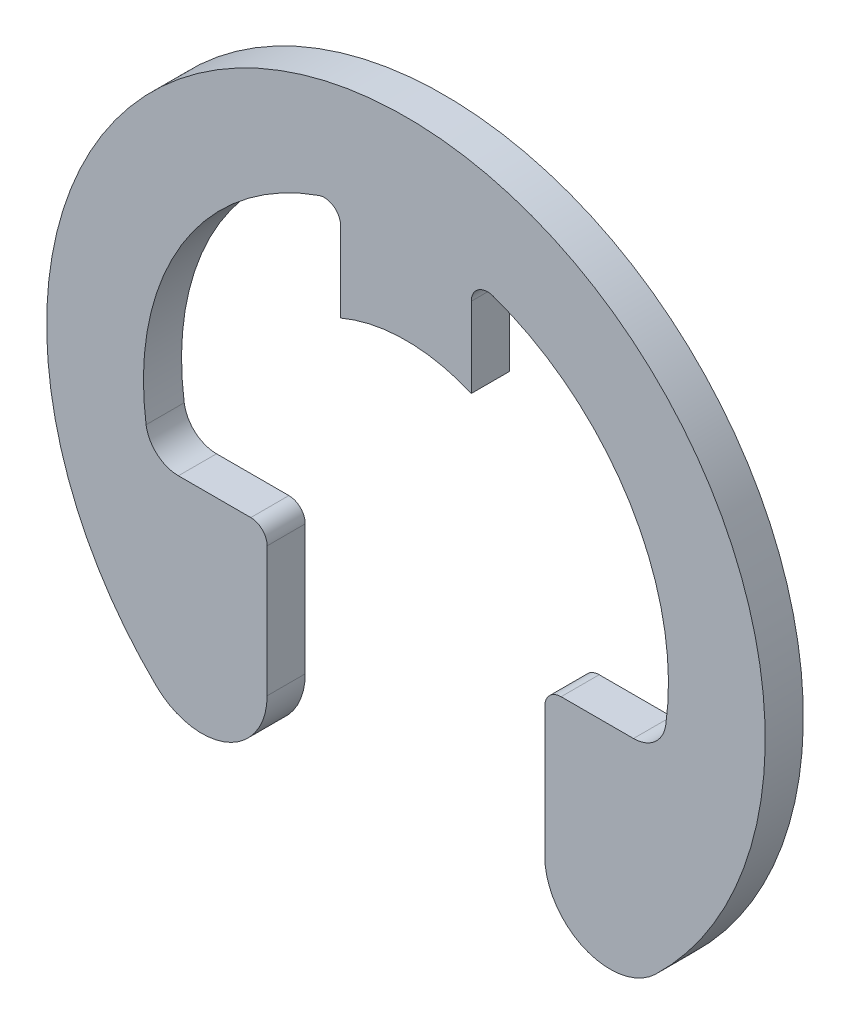
ISO-10303-21;
HEADER;
FILE_DESCRIPTION(('STEP AP214'),'2;1');
FILE_NAME('part.step','',(''),(''),'','','');
FILE_SCHEMA(('AUTOMOTIVE_DESIGN { 1 0 10303 214 1 1 1 1 }'));
ENDSEC;
DATA;
#1=APPLICATION_CONTEXT('core data for automotive mechanical design processes');
#2=APPLICATION_PROTOCOL_DEFINITION('international standard','automotive_design',2000,#1);
#3=PRODUCT_CONTEXT('',#1,'mechanical');
#4=PRODUCT('Part','Part','',(#3));
#5=PRODUCT_RELATED_PRODUCT_CATEGORY('part','',(#4));
#6=PRODUCT_DEFINITION_FORMATION('','',#4);
#7=PRODUCT_DEFINITION_CONTEXT('part definition',#1,'design');
#8=PRODUCT_DEFINITION('design','',#6,#7);
#9=PRODUCT_DEFINITION_SHAPE('','',#8);
#10=(LENGTH_UNIT() NAMED_UNIT(*) SI_UNIT(.MILLI.,.METRE.));
#11=(NAMED_UNIT(*) PLANE_ANGLE_UNIT() SI_UNIT($,.RADIAN.));
#12=(NAMED_UNIT(*) SI_UNIT($,.STERADIAN.) SOLID_ANGLE_UNIT());
#13=UNCERTAINTY_MEASURE_WITH_UNIT(LENGTH_MEASURE(1.E-05),#10,'distance_accuracy_value','');
#14=(GEOMETRIC_REPRESENTATION_CONTEXT(3) GLOBAL_UNCERTAINTY_ASSIGNED_CONTEXT((#13)) GLOBAL_UNIT_ASSIGNED_CONTEXT((#10,
#11,#12)) REPRESENTATION_CONTEXT('',''));
#15=CARTESIAN_POINT('',(0.,0.,0.));
#16=DIRECTION('',(0.,0.,1.));
#17=DIRECTION('',(1.,0.,0.));
#18=AXIS2_PLACEMENT_3D('',#15,#16,#17);
#19=CARTESIAN_POINT('',(4.7625,-5.89632434785133,0.444500000000002));
#20=DIRECTION('',(0.,0.,1.));
#21=DIRECTION('',(1.,0.,0.));
#22=AXIS2_PLACEMENT_3D('',#19,#20,#21);
#23=PLANE('',#22);
#24=CARTESIAN_POINT('',(3.61949999999996,-2.86667565214866,0.444500000000002));
#25=DIRECTION('',(0.,0.,1.));
#26=DIRECTION('',(1.,0.,0.));
#27=AXIS2_PLACEMENT_3D('',#24,#25,#26);
#28=CIRCLE('',#27,0.380999999999999);
#29=CARTESIAN_POINT('',(3.23849999999994,-2.86667565214866,0.444500000000002));
#30=VERTEX_POINT('',#29);
#31=CARTESIAN_POINT('',(3.61949999999996,-2.48567565214866,0.444500000000002));
#32=VERTEX_POINT('',#31);
#33=EDGE_CURVE('E169',#30,#32,#28,.F.);
#34=ORIENTED_EDGE('',*,*,#33,.F.);
#35=DIRECTION('',(0.,1.,0.));
#36=VECTOR('',#35,1.);
#37=CARTESIAN_POINT('',(3.23849999999994,-2.86667565214866,0.444500000000002));
#38=LINE('',#37,#36);
#39=CARTESIAN_POINT('',(3.23849999999997,-5.89632434785133,0.444500000000002));
#40=VERTEX_POINT('',#39);
#41=EDGE_CURVE('E162',#30,#40,#38,.F.);
#42=ORIENTED_EDGE('',*,*,#41,.T.);
#43=CARTESIAN_POINT('',(4.7625,-5.89632434785133,0.444500000000002));
#44=DIRECTION('',(0.,0.,1.));
#45=DIRECTION('',(1.,0.,0.));
#46=AXIS2_PLACEMENT_3D('',#43,#44,#45);
#47=CIRCLE('',#46,1.524);
#48=CARTESIAN_POINT('',(5.82083330642028,-6.99291297287054,0.444500000000002));
#49=VERTEX_POINT('',#48);
#50=EDGE_CURVE('E150',#49,#40,#47,.F.);
#51=ORIENTED_EDGE('',*,*,#50,.F.);
#52=CARTESIAN_POINT('',(0.,-0.961675652148666,0.444500000000002));
#53=DIRECTION('',(0.,0.,1.));
#54=DIRECTION('',(1.,0.,0.));
#55=AXIS2_PLACEMENT_3D('',#52,#53,#54);
#56=CIRCLE('',#55,8.382);
#57=CARTESIAN_POINT('',(-5.82083333333337,-6.99291294689634,0.444500000000002));
#58=VERTEX_POINT('',#57);
#59=EDGE_CURVE('E19',#58,#49,#56,.F.);
#60=ORIENTED_EDGE('',*,*,#59,.F.);
#61=CARTESIAN_POINT('',(-4.7625,-5.89632434785133,0.444500000000002));
#62=DIRECTION('',(0.,0.,1.));
#63=DIRECTION('',(1.,0.,0.));
#64=AXIS2_PLACEMENT_3D('',#61,#62,#63);
#65=CIRCLE('',#64,1.524);
#66=CARTESIAN_POINT('',(-3.23850000000012,-5.89632434785133,0.444500000000002));
#67=VERTEX_POINT('',#66);
#68=EDGE_CURVE('E136',#67,#58,#65,.F.);
#69=ORIENTED_EDGE('',*,*,#68,.F.);
#70=DIRECTION('',(0.,1.,0.));
#71=VECTOR('',#70,1.);
#72=CARTESIAN_POINT('',(-3.23850000000012,-5.89632434785133,0.444500000000002));
#73=LINE('',#72,#71);
#74=CARTESIAN_POINT('',(-3.23850000000013,-2.86667565214866,0.444500000000002));
#75=VERTEX_POINT('',#74);
#76=EDGE_CURVE('E158',#67,#75,#73,.T.);
#77=ORIENTED_EDGE('',*,*,#76,.T.);
#78=CARTESIAN_POINT('',(-3.61950000000014,-2.86667565214866,0.444500000000002));
#79=DIRECTION('',(0.,0.,1.));
#80=DIRECTION('',(1.,0.,0.));
#81=AXIS2_PLACEMENT_3D('',#78,#79,#80);
#82=CIRCLE('',#81,0.380999999999999);
#83=CARTESIAN_POINT('',(-3.61950000000014,-2.48567565214866,0.444500000000002));
#84=VERTEX_POINT('',#83);
#85=EDGE_CURVE('E183',#84,#75,#82,.F.);
#86=ORIENTED_EDGE('',*,*,#85,.F.);
#87=DIRECTION('',(1.,0.,0.));
#88=VECTOR('',#87,1.);
#89=CARTESIAN_POINT('',(-3.61950000000014,-2.48567565214866,0.444500000000002));
#90=LINE('',#89,#88);
#91=CARTESIAN_POINT('',(-5.30816038101955,-2.48567565214866,0.444500000000002));
#92=VERTEX_POINT('',#91);
#93=EDGE_CURVE('E179',#84,#92,#90,.F.);
#94=ORIENTED_EDGE('',*,*,#93,.T.);
#95=CARTESIAN_POINT('',(-5.30816038101955,-1.72367565214867,0.444500000000002));
#96=DIRECTION('',(0.,0.,1.));
#97=DIRECTION('',(1.,0.,0.));
#98=AXIS2_PLACEMENT_3D('',#95,#96,#97);
#99=CIRCLE('',#98,0.761999999999999);
#100=CARTESIAN_POINT('',(-6.06242828947552,-1.83195271469384,0.444500000000002));
#101=VERTEX_POINT('',#100);
#102=EDGE_CURVE('E239',#92,#101,#99,.F.);
#103=ORIENTED_EDGE('',*,*,#102,.T.);
#104=CARTESIAN_POINT('',(0.,-0.961675652148661,0.444500000000002));
#105=DIRECTION('',(0.,0.,1.));
#106=DIRECTION('',(1.,0.,0.));
#107=AXIS2_PLACEMENT_3D('',#104,#105,#106);
#108=CIRCLE('',#107,6.12457499999999);
#109=CARTESIAN_POINT('',(-2.03136811457101,4.81620999172915,0.444500000000002));
#110=VERTEX_POINT('',#109);
#111=EDGE_CURVE('E236',#101,#110,#108,.F.);
#112=ORIENTED_EDGE('',*,*,#111,.T.);
#113=CARTESIAN_POINT('',(-1.90500000000007,4.4567769665078,0.444500000000002));
#114=DIRECTION('',(0.,0.,1.));
#115=DIRECTION('',(1.,0.,0.));
#116=AXIS2_PLACEMENT_3D('',#113,#114,#115);
#117=CIRCLE('',#116,0.381000000000001);
#118=CARTESIAN_POINT('',(-1.52400000000006,4.4567769665078,0.444500000000002));
#119=VERTEX_POINT('',#118);
#120=EDGE_CURVE('E233',#110,#119,#117,.F.);
#121=ORIENTED_EDGE('',*,*,#120,.T.);
#122=DIRECTION('',(0.,1.,0.));
#123=VECTOR('',#122,1.);
#124=CARTESIAN_POINT('',(-1.52400000000006,4.45677696650779,0.444500000000002));
#125=LINE('',#124,#123);
#126=CARTESIAN_POINT('',(-1.52400000000005,2.59251527160597,0.444500000000002));
#127=VERTEX_POINT('',#126);
#128=EDGE_CURVE('E175',#119,#127,#125,.F.);
#129=ORIENTED_EDGE('',*,*,#128,.T.);
#130=CARTESIAN_POINT('',(0.,-0.961675652148671,0.444500000000002));
#131=DIRECTION('',(0.,0.,1.));
#132=DIRECTION('',(1.,0.,0.));
#133=AXIS2_PLACEMENT_3D('',#130,#131,#132);
#134=CIRCLE('',#133,3.86715);
#135=CARTESIAN_POINT('',(1.52399999999988,2.59251527160602,0.444500000000002));
#136=VERTEX_POINT('',#135);
#137=EDGE_CURVE('E231',#127,#136,#134,.F.);
#138=ORIENTED_EDGE('',*,*,#137,.T.);
#139=DIRECTION('',(0.,1.,0.));
#140=VECTOR('',#139,1.);
#141=CARTESIAN_POINT('',(1.52399999999988,2.59251527160599,0.444500000000002));
#142=LINE('',#141,#140);
#143=CARTESIAN_POINT('',(1.52399999999997,4.45677696650779,0.444500000000002));
#144=VERTEX_POINT('',#143);
#145=EDGE_CURVE('E171',#136,#144,#142,.T.);
#146=ORIENTED_EDGE('',*,*,#145,.T.);
#147=CARTESIAN_POINT('',(1.90500000000007,4.45677696650779,0.444500000000002));
#148=DIRECTION('',(0.,0.,1.));
#149=DIRECTION('',(1.,0.,0.));
#150=AXIS2_PLACEMENT_3D('',#147,#148,#149);
#151=CIRCLE('',#150,0.381000000000001);
#152=CARTESIAN_POINT('',(2.03136814974417,4.8162099793631,0.444500000000002));
#153=VERTEX_POINT('',#152);
#154=EDGE_CURVE('E229',#144,#153,#151,.F.);
#155=ORIENTED_EDGE('',*,*,#154,.T.);
#156=CARTESIAN_POINT('',(0.,-0.961675652148662,0.444500000000002));
#157=DIRECTION('',(0.,0.,1.));
#158=DIRECTION('',(1.,0.,0.));
#159=AXIS2_PLACEMENT_3D('',#156,#157,#158);
#160=CIRCLE('',#159,6.124575);
#161=CARTESIAN_POINT('',(6.06242829268276,-1.83195269235131,0.444500000000002));
#162=VERTEX_POINT('',#161);
#163=EDGE_CURVE('E226',#153,#162,#160,.F.);
#164=ORIENTED_EDGE('',*,*,#163,.T.);
#165=CARTESIAN_POINT('',(5.30816038101937,-1.72367565214867,0.444500000000002));
#166=DIRECTION('',(0.,0.,1.));
#167=DIRECTION('',(1.,0.,0.));
#168=AXIS2_PLACEMENT_3D('',#165,#166,#167);
#169=CIRCLE('',#168,0.761999999999999);
#170=CARTESIAN_POINT('',(5.30816038101937,-2.48567565214866,0.444500000000002));
#171=VERTEX_POINT('',#170);
#172=EDGE_CURVE('E223',#162,#171,#169,.F.);
#173=ORIENTED_EDGE('',*,*,#172,.T.);
#174=DIRECTION('',(1.,0.,0.));
#175=VECTOR('',#174,1.);
#176=CARTESIAN_POINT('',(5.30816038101937,-2.48567565214866,0.444500000000002));
#177=LINE('',#176,#175);
#178=EDGE_CURVE('E166',#171,#32,#177,.F.);
#179=ORIENTED_EDGE('',*,*,#178,.T.);
#180=EDGE_LOOP('',(#34,#42,#51,#60,#69,#77,#86,#94,#103,#112,#121,#129,#138,#146,#155,#164,#173,#179));
#181=FACE_BOUND('',#180,.T.);
#182=ADVANCED_FACE('F16',(#181),#23,.T.);
#183=CARTESIAN_POINT('',(0.,-0.961675652148666,0.444500000000002));
#184=DIRECTION('',(0.,0.,1.));
#185=DIRECTION('',(1.,0.,0.));
#186=AXIS2_PLACEMENT_3D('',#183,#184,#185);
#187=CYLINDRICAL_SURFACE('',#186,8.382);
#188=ORIENTED_EDGE('',*,*,#59,.T.);
#189=DIRECTION('',(0.,0.,1.));
#190=VECTOR('',#189,1.);
#191=CARTESIAN_POINT('',(5.82083327950723,-6.99291299884471,0.444500000000002));
#192=LINE('',#191,#190);
#193=CARTESIAN_POINT('',(5.82083330642028,-6.99291297287054,-0.444499999999999));
#194=VERTEX_POINT('',#193);
#195=EDGE_CURVE('E164',#194,#49,#192,.T.);
#196=ORIENTED_EDGE('',*,*,#195,.F.);
#197=CARTESIAN_POINT('',(0.,-0.961675652148666,-0.444499999999999));
#198=DIRECTION('',(0.,0.,1.));
#199=DIRECTION('',(1.,0.,0.));
#200=AXIS2_PLACEMENT_3D('',#197,#198,#199);
#201=CIRCLE('',#200,8.382);
#202=CARTESIAN_POINT('',(-5.82083333333337,-6.99291294689634,-0.444499999999999));
#203=VERTEX_POINT('',#202);
#204=EDGE_CURVE('E156',#194,#203,#201,.T.);
#205=ORIENTED_EDGE('',*,*,#204,.T.);
#206=DIRECTION('',(0.,0.,1.));
#207=VECTOR('',#206,1.);
#208=CARTESIAN_POINT('',(-5.8208333333334,-6.9929129468963,0.444500000000002));
#209=LINE('',#208,#207);
#210=EDGE_CURVE('E141',#58,#203,#209,.F.);
#211=ORIENTED_EDGE('',*,*,#210,.F.);
#212=EDGE_LOOP('',(#188,#196,#205,#211));
#213=FACE_BOUND('',#212,.T.);
#214=ADVANCED_FACE('F155',(#213),#187,.T.);
#215=CARTESIAN_POINT('',(-4.7625,-5.89632434785133,0.444500000000002));
#216=DIRECTION('',(0.,0.,1.));
#217=DIRECTION('',(1.,0.,0.));
#218=AXIS2_PLACEMENT_3D('',#215,#216,#217);
#219=CYLINDRICAL_SURFACE('',#218,1.524);
#220=ORIENTED_EDGE('',*,*,#68,.T.);
#221=ORIENTED_EDGE('',*,*,#210,.T.);
#222=CARTESIAN_POINT('',(-4.7625,-5.89632434785133,-0.444499999999999));
#223=DIRECTION('',(0.,0.,1.));
#224=DIRECTION('',(1.,0.,0.));
#225=AXIS2_PLACEMENT_3D('',#222,#223,#224);
#226=CIRCLE('',#225,1.524);
#227=CARTESIAN_POINT('',(-3.23850000000012,-5.89632434785133,-0.444499999999999));
#228=VERTEX_POINT('',#227);
#229=EDGE_CURVE('E217',#203,#228,#226,.T.);
#230=ORIENTED_EDGE('',*,*,#229,.T.);
#231=DIRECTION('',(0.,0.,1.));
#232=VECTOR('',#231,1.);
#233=CARTESIAN_POINT('',(-3.23850000000012,-5.89632434785133,0.444500000000002));
#234=LINE('',#233,#232);
#235=EDGE_CURVE('E143',#228,#67,#234,.T.);
#236=ORIENTED_EDGE('',*,*,#235,.T.);
#237=EDGE_LOOP('',(#220,#221,#230,#236));
#238=FACE_BOUND('',#237,.T.);
#239=ADVANCED_FACE('F138',(#238),#219,.T.);
#240=CARTESIAN_POINT('',(-3.23850000000012,-5.89632434785133,0.444500000000002));
#241=DIRECTION('',(-1.,0.,0.));
#242=DIRECTION('',(0.,0.,1.));
#243=AXIS2_PLACEMENT_3D('',#240,#241,#242);
#244=PLANE('',#243);
#245=DIRECTION('',(0.,0.,1.));
#246=VECTOR('',#245,1.);
#247=CARTESIAN_POINT('',(-3.23850000000014,-2.86667565214866,0.444500000000002));
#248=LINE('',#247,#246);
#249=CARTESIAN_POINT('',(-3.23850000000013,-2.86667565214866,-0.444499999999999));
#250=VERTEX_POINT('',#249);
#251=EDGE_CURVE('E241',#75,#250,#248,.F.);
#252=ORIENTED_EDGE('',*,*,#251,.F.);
#253=ORIENTED_EDGE('',*,*,#76,.F.);
#254=ORIENTED_EDGE('',*,*,#235,.F.);
#255=DIRECTION('',(0.,1.,0.));
#256=VECTOR('',#255,1.);
#257=CARTESIAN_POINT('',(-3.23850000000012,-5.89632434785133,-0.444499999999999));
#258=LINE('',#257,#256);
#259=EDGE_CURVE('E216',#228,#250,#258,.T.);
#260=ORIENTED_EDGE('',*,*,#259,.T.);
#261=EDGE_LOOP('',(#252,#253,#254,#260));
#262=FACE_BOUND('',#261,.T.);
#263=ADVANCED_FACE('F341',(#262),#244,.F.);
#264=CARTESIAN_POINT('',(-3.61950000000014,-2.86667565214866,0.444500000000002));
#265=DIRECTION('',(0.,0.,1.));
#266=DIRECTION('',(1.,0.,0.));
#267=AXIS2_PLACEMENT_3D('',#264,#265,#266);
#268=CYLINDRICAL_SURFACE('',#267,0.380999999999999);
#269=ORIENTED_EDGE('',*,*,#85,.T.);
#270=ORIENTED_EDGE('',*,*,#251,.T.);
#271=CARTESIAN_POINT('',(-3.61950000000014,-2.86667565214866,-0.444499999999999));
#272=DIRECTION('',(0.,0.,1.));
#273=DIRECTION('',(1.,0.,0.));
#274=AXIS2_PLACEMENT_3D('',#271,#272,#273);
#275=CIRCLE('',#274,0.380999999999999);
#276=CARTESIAN_POINT('',(-3.61950000000014,-2.48567565214866,-0.444499999999999));
#277=VERTEX_POINT('',#276);
#278=EDGE_CURVE('E213',#250,#277,#275,.T.);
#279=ORIENTED_EDGE('',*,*,#278,.T.);
#280=DIRECTION('',(0.,0.,1.));
#281=VECTOR('',#280,1.);
#282=CARTESIAN_POINT('',(-3.61950000000014,-2.48567565214866,0.444500000000002));
#283=LINE('',#282,#281);
#284=EDGE_CURVE('E182',#277,#84,#283,.T.);
#285=ORIENTED_EDGE('',*,*,#284,.T.);
#286=EDGE_LOOP('',(#269,#270,#279,#285));
#287=FACE_BOUND('',#286,.T.);
#288=ADVANCED_FACE('F339',(#287),#268,.T.);
#289=CARTESIAN_POINT('',(-3.61950000000014,-2.48567565214866,0.444500000000002));
#290=DIRECTION('',(0.,-1.,0.));
#291=DIRECTION('',(1.,0.,0.));
#292=AXIS2_PLACEMENT_3D('',#289,#290,#291);
#293=PLANE('',#292);
#294=DIRECTION('',(0.,0.,1.));
#295=VECTOR('',#294,1.);
#296=CARTESIAN_POINT('',(-5.30816038101955,-2.48567565214866,0.444500000000002));
#297=LINE('',#296,#295);
#298=CARTESIAN_POINT('',(-5.30816038101956,-2.48567565214866,-0.444499999999999));
#299=VERTEX_POINT('',#298);
#300=EDGE_CURVE('E181',#299,#92,#297,.T.);
#301=ORIENTED_EDGE('',*,*,#300,.T.);
#302=ORIENTED_EDGE('',*,*,#93,.F.);
#303=ORIENTED_EDGE('',*,*,#284,.F.);
#304=DIRECTION('',(1.,0.,0.));
#305=VECTOR('',#304,1.);
#306=CARTESIAN_POINT('',(4.7625,-2.48567565214866,-0.444499999999999));
#307=LINE('',#306,#305);
#308=EDGE_CURVE('E212',#277,#299,#307,.F.);
#309=ORIENTED_EDGE('',*,*,#308,.T.);
#310=EDGE_LOOP('',(#301,#302,#303,#309));
#311=FACE_BOUND('',#310,.T.);
#312=ADVANCED_FACE('F337',(#311),#293,.F.);
#313=CARTESIAN_POINT('',(-5.30816038101955,-1.72367565214867,0.444500000000002));
#314=DIRECTION('',(0.,0.,1.));
#315=DIRECTION('',(1.,0.,0.));
#316=AXIS2_PLACEMENT_3D('',#313,#314,#315);
#317=CYLINDRICAL_SURFACE('',#316,0.761999999999999);
#318=DIRECTION('',(0.,0.,1.));
#319=VECTOR('',#318,1.);
#320=CARTESIAN_POINT('',(-6.06242829299088,-1.83195269020526,0.444500000000002));
#321=LINE('',#320,#319);
#322=CARTESIAN_POINT('',(-6.06242828947549,-1.83195271469383,-0.444499999999999));
#323=VERTEX_POINT('',#322);
#324=EDGE_CURVE('E238',#323,#101,#321,.T.);
#325=ORIENTED_EDGE('',*,*,#324,.T.);
#326=ORIENTED_EDGE('',*,*,#102,.F.);
#327=ORIENTED_EDGE('',*,*,#300,.F.);
#328=CARTESIAN_POINT('',(-5.30816038101955,-1.72367565214867,-0.444499999999999));
#329=DIRECTION('',(0.,0.,1.));
#330=DIRECTION('',(1.,0.,0.));
#331=AXIS2_PLACEMENT_3D('',#328,#329,#330);
#332=CIRCLE('',#331,0.761999999999999);
#333=EDGE_CURVE('E209',#299,#323,#332,.F.);
#334=ORIENTED_EDGE('',*,*,#333,.T.);
#335=EDGE_LOOP('',(#325,#326,#327,#334));
#336=FACE_BOUND('',#335,.T.);
#337=ADVANCED_FACE('F333',(#336),#317,.F.);
#338=CARTESIAN_POINT('',(0.,-0.961675652148661,0.444500000000002));
#339=DIRECTION('',(0.,0.,1.));
#340=DIRECTION('',(1.,0.,0.));
#341=AXIS2_PLACEMENT_3D('',#338,#339,#340);
#342=CYLINDRICAL_SURFACE('',#341,6.12457499999999);
#343=DIRECTION('',(0.,0.,1.));
#344=VECTOR('',#343,1.);
#345=CARTESIAN_POINT('',(-2.03136806993798,4.81621000742108,0.444500000000002));
#346=LINE('',#345,#344);
#347=CARTESIAN_POINT('',(-2.03136811457102,4.81620999172917,-0.444499999999999));
#348=VERTEX_POINT('',#347);
#349=EDGE_CURVE('E235',#348,#110,#346,.T.);
#350=ORIENTED_EDGE('',*,*,#349,.T.);
#351=ORIENTED_EDGE('',*,*,#111,.F.);
#352=ORIENTED_EDGE('',*,*,#324,.F.);
#353=CARTESIAN_POINT('',(0.,-0.961675652148661,-0.444499999999999));
#354=DIRECTION('',(0.,0.,1.));
#355=DIRECTION('',(1.,0.,0.));
#356=AXIS2_PLACEMENT_3D('',#353,#354,#355);
#357=CIRCLE('',#356,6.12457499999999);
#358=EDGE_CURVE('E206',#323,#348,#357,.F.);
#359=ORIENTED_EDGE('',*,*,#358,.T.);
#360=EDGE_LOOP('',(#350,#351,#352,#359));
#361=FACE_BOUND('',#360,.T.);
#362=ADVANCED_FACE('F329',(#361),#342,.F.);
#363=CARTESIAN_POINT('',(-1.90500000000007,4.4567769665078,0.444500000000002));
#364=DIRECTION('',(0.,0.,1.));
#365=DIRECTION('',(1.,0.,0.));
#366=AXIS2_PLACEMENT_3D('',#363,#364,#365);
#367=CYLINDRICAL_SURFACE('',#366,0.381000000000001);
#368=DIRECTION('',(0.,0.,-1.));
#369=VECTOR('',#368,1.);
#370=CARTESIAN_POINT('',(-1.52400000000006,4.4567769665078,0.444500000000002));
#371=LINE('',#370,#369);
#372=CARTESIAN_POINT('',(-1.52400000000006,4.4567769665078,-0.444499999999999));
#373=VERTEX_POINT('',#372);
#374=EDGE_CURVE('E178',#373,#119,#371,.F.);
#375=ORIENTED_EDGE('',*,*,#374,.T.);
#376=ORIENTED_EDGE('',*,*,#120,.F.);
#377=ORIENTED_EDGE('',*,*,#349,.F.);
#378=CARTESIAN_POINT('',(-1.90500000000007,4.4567769665078,-0.444499999999999));
#379=DIRECTION('',(0.,0.,1.));
#380=DIRECTION('',(1.,0.,0.));
#381=AXIS2_PLACEMENT_3D('',#378,#379,#380);
#382=CIRCLE('',#381,0.381000000000001);
#383=EDGE_CURVE('E203',#348,#373,#382,.F.);
#384=ORIENTED_EDGE('',*,*,#383,.T.);
#385=EDGE_LOOP('',(#375,#376,#377,#384));
#386=FACE_BOUND('',#385,.T.);
#387=ADVANCED_FACE('F325',(#386),#367,.F.);
#388=CARTESIAN_POINT('',(-1.52400000000006,4.45677696650779,0.444500000000002));
#389=DIRECTION('',(1.,0.,0.));
#390=DIRECTION('',(0.,0.,-1.));
#391=AXIS2_PLACEMENT_3D('',#388,#389,#390);
#392=PLANE('',#391);
#393=DIRECTION('',(0.,0.,1.));
#394=VECTOR('',#393,1.);
#395=CARTESIAN_POINT('',(-1.52400000000005,2.59251527160597,0.444500000000002));
#396=LINE('',#395,#394);
#397=CARTESIAN_POINT('',(-1.52400000000005,2.59251527160597,-0.444499999999999));
#398=VERTEX_POINT('',#397);
#399=EDGE_CURVE('E177',#398,#127,#396,.T.);
#400=ORIENTED_EDGE('',*,*,#399,.T.);
#401=ORIENTED_EDGE('',*,*,#128,.F.);
#402=ORIENTED_EDGE('',*,*,#374,.F.);
#403=DIRECTION('',(0.,1.,0.));
#404=VECTOR('',#403,1.);
#405=CARTESIAN_POINT('',(-1.52400000000006,-5.89632434785133,-0.444499999999999));
#406=LINE('',#405,#404);
#407=EDGE_CURVE('E202',#373,#398,#406,.F.);
#408=ORIENTED_EDGE('',*,*,#407,.T.);
#409=EDGE_LOOP('',(#400,#401,#402,#408));
#410=FACE_BOUND('',#409,.T.);
#411=ADVANCED_FACE('F321',(#410),#392,.F.);
#412=CARTESIAN_POINT('',(0.,-0.961675652148671,0.444500000000002));
#413=DIRECTION('',(0.,0.,1.));
#414=DIRECTION('',(1.,0.,0.));
#415=AXIS2_PLACEMENT_3D('',#412,#413,#414);
#416=CYLINDRICAL_SURFACE('',#415,3.86715);
#417=DIRECTION('',(0.,0.,1.));
#418=VECTOR('',#417,1.);
#419=CARTESIAN_POINT('',(1.52399999999988,2.59251527160599,0.444500000000002));
#420=LINE('',#419,#418);
#421=CARTESIAN_POINT('',(1.52399999999988,2.59251527160602,-0.444499999999999));
#422=VERTEX_POINT('',#421);
#423=EDGE_CURVE('E174',#422,#136,#420,.T.);
#424=ORIENTED_EDGE('',*,*,#423,.T.);
#425=ORIENTED_EDGE('',*,*,#137,.F.);
#426=ORIENTED_EDGE('',*,*,#399,.F.);
#427=CARTESIAN_POINT('',(0.,-0.961675652148671,-0.444499999999999));
#428=DIRECTION('',(0.,0.,1.));
#429=DIRECTION('',(1.,0.,0.));
#430=AXIS2_PLACEMENT_3D('',#427,#428,#429);
#431=CIRCLE('',#430,3.86715);
#432=EDGE_CURVE('E199',#398,#422,#431,.F.);
#433=ORIENTED_EDGE('',*,*,#432,.T.);
#434=EDGE_LOOP('',(#424,#425,#426,#433));
#435=FACE_BOUND('',#434,.T.);
#436=ADVANCED_FACE('F317',(#435),#416,.F.);
#437=CARTESIAN_POINT('',(1.52399999999988,2.59251527160599,0.444500000000002));
#438=DIRECTION('',(-1.,0.,0.));
#439=DIRECTION('',(0.,0.,1.));
#440=AXIS2_PLACEMENT_3D('',#437,#438,#439);
#441=PLANE('',#440);
#442=DIRECTION('',(0.,0.,1.));
#443=VECTOR('',#442,1.);
#444=CARTESIAN_POINT('',(1.52400000000007,4.45677696650779,0.444500000000002));
#445=LINE('',#444,#443);
#446=CARTESIAN_POINT('',(1.52399999999997,4.45677696650779,-0.444499999999999));
#447=VERTEX_POINT('',#446);
#448=EDGE_CURVE('E173',#447,#144,#445,.T.);
#449=ORIENTED_EDGE('',*,*,#448,.T.);
#450=ORIENTED_EDGE('',*,*,#145,.F.);
#451=ORIENTED_EDGE('',*,*,#423,.F.);
#452=DIRECTION('',(0.,1.,0.));
#453=VECTOR('',#452,1.);
#454=CARTESIAN_POINT('',(1.52399999999988,-5.89632434785133,-0.444499999999999));
#455=LINE('',#454,#453);
#456=EDGE_CURVE('E198',#422,#447,#455,.T.);
#457=ORIENTED_EDGE('',*,*,#456,.T.);
#458=EDGE_LOOP('',(#449,#450,#451,#457));
#459=FACE_BOUND('',#458,.T.);
#460=ADVANCED_FACE('F313',(#459),#441,.F.);
#461=CARTESIAN_POINT('',(1.90500000000007,4.45677696650779,0.444500000000002));
#462=DIRECTION('',(0.,0.,1.));
#463=DIRECTION('',(1.,0.,0.));
#464=AXIS2_PLACEMENT_3D('',#461,#462,#463);
#465=CYLINDRICAL_SURFACE('',#464,0.381000000000001);
#466=DIRECTION('',(0.,0.,1.));
#467=VECTOR('',#466,1.);
#468=CARTESIAN_POINT('',(2.03136814028428,4.81620998268896,0.444500000000002));
#469=LINE('',#468,#467);
#470=CARTESIAN_POINT('',(2.03136814974417,4.81620997936309,-0.444499999999999));
#471=VERTEX_POINT('',#470);
#472=EDGE_CURVE('E228',#471,#153,#469,.T.);
#473=ORIENTED_EDGE('',*,*,#472,.T.);
#474=ORIENTED_EDGE('',*,*,#154,.F.);
#475=ORIENTED_EDGE('',*,*,#448,.F.);
#476=CARTESIAN_POINT('',(1.90500000000007,4.45677696650779,-0.444499999999999));
#477=DIRECTION('',(0.,0.,1.));
#478=DIRECTION('',(1.,0.,0.));
#479=AXIS2_PLACEMENT_3D('',#476,#477,#478);
#480=CIRCLE('',#479,0.381000000000001);
#481=EDGE_CURVE('E195',#447,#471,#480,.F.);
#482=ORIENTED_EDGE('',*,*,#481,.T.);
#483=EDGE_LOOP('',(#473,#474,#475,#482));
#484=FACE_BOUND('',#483,.T.);
#485=ADVANCED_FACE('F309',(#484),#465,.F.);
#486=CARTESIAN_POINT('',(0.,-0.961675652148662,0.444500000000002));
#487=DIRECTION('',(0.,0.,1.));
#488=DIRECTION('',(1.,0.,0.));
#489=AXIS2_PLACEMENT_3D('',#486,#487,#488);
#490=CYLINDRICAL_SURFACE('',#489,6.124575);
#491=DIRECTION('',(0.,0.,1.));
#492=VECTOR('',#491,1.);
#493=CARTESIAN_POINT('',(6.06242829940542,-1.83195264552019,0.444500000000002));
#494=LINE('',#493,#492);
#495=CARTESIAN_POINT('',(6.0624282926827,-1.8319526923513,-0.444499999999999));
#496=VERTEX_POINT('',#495);
#497=EDGE_CURVE('E225',#496,#162,#494,.T.);
#498=ORIENTED_EDGE('',*,*,#497,.T.);
#499=ORIENTED_EDGE('',*,*,#163,.F.);
#500=ORIENTED_EDGE('',*,*,#472,.F.);
#501=CARTESIAN_POINT('',(0.,-0.961675652148662,-0.444499999999999));
#502=DIRECTION('',(0.,0.,1.));
#503=DIRECTION('',(1.,0.,0.));
#504=AXIS2_PLACEMENT_3D('',#501,#502,#503);
#505=CIRCLE('',#504,6.124575);
#506=EDGE_CURVE('E192',#471,#496,#505,.F.);
#507=ORIENTED_EDGE('',*,*,#506,.T.);
#508=EDGE_LOOP('',(#498,#499,#500,#507));
#509=FACE_BOUND('',#508,.T.);
#510=ADVANCED_FACE('F305',(#509),#490,.F.);
#511=CARTESIAN_POINT('',(5.30816038101937,-1.72367565214867,0.444500000000002));
#512=DIRECTION('',(0.,0.,1.));
#513=DIRECTION('',(1.,0.,0.));
#514=AXIS2_PLACEMENT_3D('',#511,#512,#513);
#515=CYLINDRICAL_SURFACE('',#514,0.761999999999999);
#516=DIRECTION('',(0.,0.,1.));
#517=VECTOR('',#516,1.);
#518=CARTESIAN_POINT('',(5.30816038101937,-2.48567565214866,0.444500000000002));
#519=LINE('',#518,#517);
#520=CARTESIAN_POINT('',(5.30816038101937,-2.48567565214866,-0.444499999999999));
#521=VERTEX_POINT('',#520);
#522=EDGE_CURVE('E170',#521,#171,#519,.T.);
#523=ORIENTED_EDGE('',*,*,#522,.T.);
#524=ORIENTED_EDGE('',*,*,#172,.F.);
#525=ORIENTED_EDGE('',*,*,#497,.F.);
#526=CARTESIAN_POINT('',(5.30816038101937,-1.72367565214867,-0.444499999999999));
#527=DIRECTION('',(0.,0.,1.));
#528=DIRECTION('',(1.,0.,0.));
#529=AXIS2_PLACEMENT_3D('',#526,#527,#528);
#530=CIRCLE('',#529,0.761999999999999);
#531=EDGE_CURVE('E189',#496,#521,#530,.F.);
#532=ORIENTED_EDGE('',*,*,#531,.T.);
#533=EDGE_LOOP('',(#523,#524,#525,#532));
#534=FACE_BOUND('',#533,.T.);
#535=ADVANCED_FACE('F301',(#534),#515,.F.);
#536=CARTESIAN_POINT('',(5.30816038101937,-2.48567565214866,0.444500000000002));
#537=DIRECTION('',(0.,-1.,0.));
#538=DIRECTION('',(1.,0.,0.));
#539=AXIS2_PLACEMENT_3D('',#536,#537,#538);
#540=PLANE('',#539);
#541=DIRECTION('',(0.,0.,1.));
#542=VECTOR('',#541,1.);
#543=CARTESIAN_POINT('',(3.61949999999996,-2.48567565214866,0.444500000000002));
#544=LINE('',#543,#542);
#545=CARTESIAN_POINT('',(3.61949999999996,-2.48567565214866,-0.444499999999999));
#546=VERTEX_POINT('',#545);
#547=EDGE_CURVE('E222',#32,#546,#544,.F.);
#548=ORIENTED_EDGE('',*,*,#547,.F.);
#549=ORIENTED_EDGE('',*,*,#178,.F.);
#550=ORIENTED_EDGE('',*,*,#522,.F.);
#551=DIRECTION('',(1.,0.,0.));
#552=VECTOR('',#551,1.);
#553=CARTESIAN_POINT('',(4.7625,-2.48567565214866,-0.444499999999999));
#554=LINE('',#553,#552);
#555=EDGE_CURVE('E188',#521,#546,#554,.F.);
#556=ORIENTED_EDGE('',*,*,#555,.T.);
#557=EDGE_LOOP('',(#548,#549,#550,#556));
#558=FACE_BOUND('',#557,.T.);
#559=ADVANCED_FACE('F297',(#558),#540,.F.);
#560=CARTESIAN_POINT('',(3.61949999999996,-2.86667565214866,0.444500000000002));
#561=DIRECTION('',(0.,0.,1.));
#562=DIRECTION('',(1.,0.,0.));
#563=AXIS2_PLACEMENT_3D('',#560,#561,#562);
#564=CYLINDRICAL_SURFACE('',#563,0.380999999999999);
#565=ORIENTED_EDGE('',*,*,#33,.T.);
#566=ORIENTED_EDGE('',*,*,#547,.T.);
#567=CARTESIAN_POINT('',(3.61949999999996,-2.86667565214866,-0.444499999999999));
#568=DIRECTION('',(0.,0.,1.));
#569=DIRECTION('',(1.,0.,0.));
#570=AXIS2_PLACEMENT_3D('',#567,#568,#569);
#571=CIRCLE('',#570,0.380999999999999);
#572=CARTESIAN_POINT('',(3.23849999999994,-2.86667565214866,-0.444499999999999));
#573=VERTEX_POINT('',#572);
#574=EDGE_CURVE('E185',#546,#573,#571,.T.);
#575=ORIENTED_EDGE('',*,*,#574,.T.);
#576=DIRECTION('',(0.,0.,-1.));
#577=VECTOR('',#576,1.);
#578=CARTESIAN_POINT('',(3.23849999999994,-2.86667565214866,0.444500000000002));
#579=LINE('',#578,#577);
#580=EDGE_CURVE('E165',#573,#30,#579,.F.);
#581=ORIENTED_EDGE('',*,*,#580,.T.);
#582=EDGE_LOOP('',(#565,#566,#575,#581));
#583=FACE_BOUND('',#582,.T.);
#584=ADVANCED_FACE('F293',(#583),#564,.T.);
#585=CARTESIAN_POINT('',(3.23849999999994,-2.86667565214866,0.444500000000002));
#586=DIRECTION('',(1.,0.,0.));
#587=DIRECTION('',(0.,0.,-1.));
#588=AXIS2_PLACEMENT_3D('',#585,#586,#587);
#589=PLANE('',#588);
#590=DIRECTION('',(0.,0.,1.));
#591=VECTOR('',#590,1.);
#592=CARTESIAN_POINT('',(3.2385,-5.89632434785133,0.444500000000002));
#593=LINE('',#592,#591);
#594=CARTESIAN_POINT('',(3.23849999999997,-5.89632434785133,-0.444499999999999));
#595=VERTEX_POINT('',#594);
#596=EDGE_CURVE('E33',#40,#595,#593,.F.);
#597=ORIENTED_EDGE('',*,*,#596,.F.);
#598=ORIENTED_EDGE('',*,*,#41,.F.);
#599=ORIENTED_EDGE('',*,*,#580,.F.);
#600=DIRECTION('',(0.,1.,0.));
#601=VECTOR('',#600,1.);
#602=CARTESIAN_POINT('',(3.23849999999994,-5.89632434785133,-0.444499999999999));
#603=LINE('',#602,#601);
#604=EDGE_CURVE('E25',#573,#595,#603,.F.);
#605=ORIENTED_EDGE('',*,*,#604,.T.);
#606=EDGE_LOOP('',(#597,#598,#599,#605));
#607=FACE_BOUND('',#606,.T.);
#608=ADVANCED_FACE('F286',(#607),#589,.F.);
#609=CARTESIAN_POINT('',(4.7625,-5.89632434785133,0.444500000000002));
#610=DIRECTION('',(0.,0.,1.));
#611=DIRECTION('',(1.,0.,0.));
#612=AXIS2_PLACEMENT_3D('',#609,#610,#611);
#613=CYLINDRICAL_SURFACE('',#612,1.524);
#614=ORIENTED_EDGE('',*,*,#50,.T.);
#615=ORIENTED_EDGE('',*,*,#596,.T.);
#616=CARTESIAN_POINT('',(4.7625,-5.89632434785133,-0.444499999999999));
#617=DIRECTION('',(0.,0.,1.));
#618=DIRECTION('',(1.,0.,0.));
#619=AXIS2_PLACEMENT_3D('',#616,#617,#618);
#620=CIRCLE('',#619,1.524);
#621=EDGE_CURVE('E10',#595,#194,#620,.T.);
#622=ORIENTED_EDGE('',*,*,#621,.T.);
#623=ORIENTED_EDGE('',*,*,#195,.T.);
#624=EDGE_LOOP('',(#614,#615,#622,#623));
#625=FACE_BOUND('',#624,.T.);
#626=ADVANCED_FACE('F352',(#625),#613,.T.);
#627=CARTESIAN_POINT('',(4.7625,-5.89632434785133,-0.444499999999999));
#628=DIRECTION('',(0.,0.,1.));
#629=DIRECTION('',(1.,0.,0.));
#630=AXIS2_PLACEMENT_3D('',#627,#628,#629);
#631=PLANE('',#630);
#632=ORIENTED_EDGE('',*,*,#604,.F.);
#633=ORIENTED_EDGE('',*,*,#574,.F.);
#634=ORIENTED_EDGE('',*,*,#555,.F.);
#635=ORIENTED_EDGE('',*,*,#531,.F.);
#636=ORIENTED_EDGE('',*,*,#506,.F.);
#637=ORIENTED_EDGE('',*,*,#481,.F.);
#638=ORIENTED_EDGE('',*,*,#456,.F.);
#639=ORIENTED_EDGE('',*,*,#432,.F.);
#640=ORIENTED_EDGE('',*,*,#407,.F.);
#641=ORIENTED_EDGE('',*,*,#383,.F.);
#642=ORIENTED_EDGE('',*,*,#358,.F.);
#643=ORIENTED_EDGE('',*,*,#333,.F.);
#644=ORIENTED_EDGE('',*,*,#308,.F.);
#645=ORIENTED_EDGE('',*,*,#278,.F.);
#646=ORIENTED_EDGE('',*,*,#259,.F.);
#647=ORIENTED_EDGE('',*,*,#229,.F.);
#648=ORIENTED_EDGE('',*,*,#204,.F.);
#649=ORIENTED_EDGE('',*,*,#621,.F.);
#650=EDGE_LOOP('',(#632,#633,#634,#635,#636,#637,#638,#639,#640,#641,#642,#643,#644,#645,#646,
#647,#648,#649));
#651=FACE_BOUND('',#650,.T.);
#652=ADVANCED_FACE('F290',(#651),#631,.F.);
#653=CLOSED_SHELL('',(#182,#214,#239,#263,#288,#312,#337,#362,#387,#411,#436,#460,#485,#510,
#535,#559,#584,#608,#626,#652));
#654=MANIFOLD_SOLID_BREP('B1',#653);
#655=ADVANCED_BREP_SHAPE_REPRESENTATION('',(#18,#654),#14);
#656=SHAPE_DEFINITION_REPRESENTATION(#9,#655);
ENDSEC;
END-ISO-10303-21;
